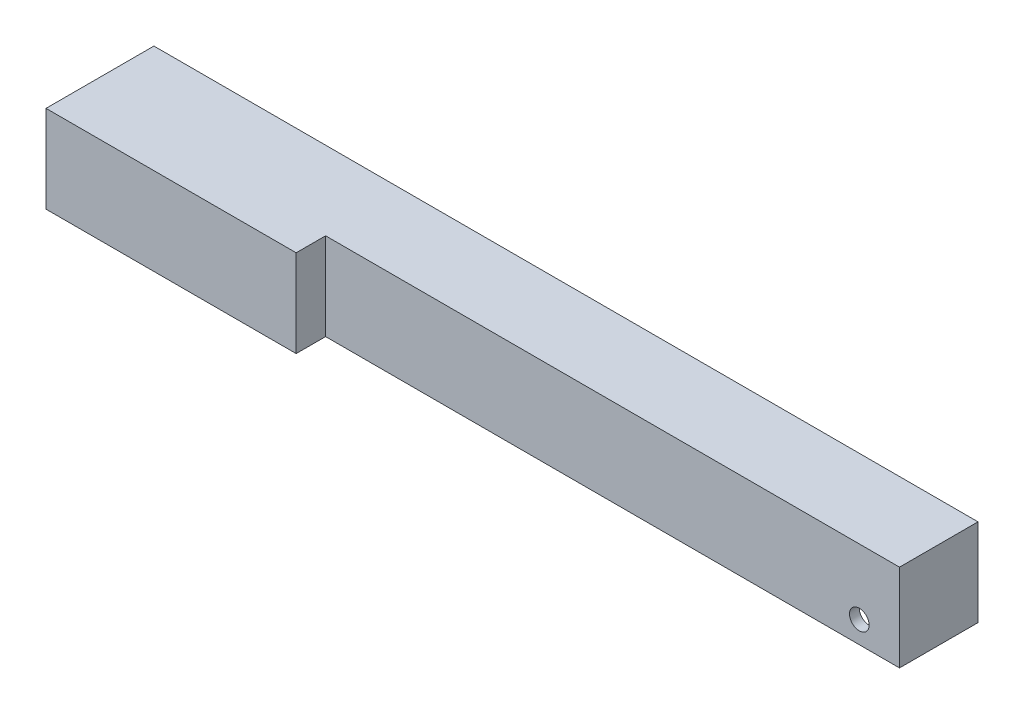
ISO-10303-21;
HEADER;
FILE_DESCRIPTION(('STEP AP214'),'2;1');
FILE_NAME('part.step','',(''),(''),'','','');
FILE_SCHEMA(('AUTOMOTIVE_DESIGN { 1 0 10303 214 1 1 1 1 }'));
ENDSEC;
DATA;
#1=APPLICATION_CONTEXT('core data for automotive mechanical design processes');
#2=APPLICATION_PROTOCOL_DEFINITION('international standard','automotive_design',2000,#1);
#3=PRODUCT_CONTEXT('',#1,'mechanical');
#4=PRODUCT('Part','Part','',(#3));
#5=PRODUCT_RELATED_PRODUCT_CATEGORY('part','',(#4));
#6=PRODUCT_DEFINITION_FORMATION('','',#4);
#7=PRODUCT_DEFINITION_CONTEXT('part definition',#1,'design');
#8=PRODUCT_DEFINITION('design','',#6,#7);
#9=PRODUCT_DEFINITION_SHAPE('','',#8);
#10=(LENGTH_UNIT() NAMED_UNIT(*) SI_UNIT(.MILLI.,.METRE.));
#11=(NAMED_UNIT(*) PLANE_ANGLE_UNIT() SI_UNIT($,.RADIAN.));
#12=(NAMED_UNIT(*) SI_UNIT($,.STERADIAN.) SOLID_ANGLE_UNIT());
#13=UNCERTAINTY_MEASURE_WITH_UNIT(LENGTH_MEASURE(1.E-05),#10,'distance_accuracy_value','');
#14=(GEOMETRIC_REPRESENTATION_CONTEXT(3) GLOBAL_UNCERTAINTY_ASSIGNED_CONTEXT((#13)) GLOBAL_UNIT_ASSIGNED_CONTEXT((#10,
#11,#12)) REPRESENTATION_CONTEXT('',''));
#15=CARTESIAN_POINT('',(0.,0.,0.));
#16=DIRECTION('',(0.,0.,1.));
#17=DIRECTION('',(1.,0.,0.));
#18=AXIS2_PLACEMENT_3D('',#15,#16,#17);
#19=CARTESIAN_POINT('',(-82.,164.984847789123,-9.));
#20=DIRECTION('',(0.,0.,-1.));
#21=DIRECTION('',(-1.,0.,0.));
#22=AXIS2_PLACEMENT_3D('',#19,#20,#21);
#23=PLANE('',#22);
#24=CARTESIAN_POINT('',(75.8000000000001,-13.35,-9.));
#25=DIRECTION('',(0.,0.,-1.));
#26=DIRECTION('',(-1.,0.,0.));
#27=AXIS2_PLACEMENT_3D('',#24,#25,#26);
#28=CIRCLE('',#27,2.);
#29=CARTESIAN_POINT('',(73.8000000000001,-13.35,-9.));
#30=VERTEX_POINT('',#29);
#31=EDGE_CURVE('E51',#30,#30,#28,.F.);
#32=ORIENTED_EDGE('',*,*,#31,.F.);
#33=EDGE_LOOP('',(#32));
#34=FACE_BOUND('',#33,.T.);
#35=DIRECTION('',(1.,0.,0.));
#36=VECTOR('',#35,1.);
#37=CARTESIAN_POINT('',(-35.,-12.3,-9.));
#38=LINE('',#37,#36);
#39=CARTESIAN_POINT('',(-82.,-12.3,-9.));
#40=VERTEX_POINT('',#39);
#41=CARTESIAN_POINT('',(-35.,-12.3,-9.));
#42=VERTEX_POINT('',#41);
#43=EDGE_CURVE('E65',#40,#42,#38,.T.);
#44=ORIENTED_EDGE('',*,*,#43,.T.);
#45=DIRECTION('',(0.,-1.,0.));
#46=VECTOR('',#45,1.);
#47=CARTESIAN_POINT('',(-35.,-12.3,-9.));
#48=LINE('',#47,#46);
#49=CARTESIAN_POINT('',(-35.,-14.3,-9.));
#50=VERTEX_POINT('',#49);
#51=EDGE_CURVE('E69',#42,#50,#48,.T.);
#52=ORIENTED_EDGE('',*,*,#51,.T.);
#53=DIRECTION('',(-1.,0.,0.));
#54=VECTOR('',#53,1.);
#55=CARTESIAN_POINT('',(-35.,-14.3,-9.));
#56=LINE('',#55,#54);
#57=CARTESIAN_POINT('',(-82.,-14.3,-9.));
#58=VERTEX_POINT('',#57);
#59=EDGE_CURVE('E196',#50,#58,#56,.T.);
#60=ORIENTED_EDGE('',*,*,#59,.T.);
#61=DIRECTION('',(0.,-1.,0.));
#62=VECTOR('',#61,1.);
#63=CARTESIAN_POINT('',(-82.,164.984847789123,-9.));
#64=LINE('',#63,#62);
#65=CARTESIAN_POINT('',(-82.,-17.8,-9.));
#66=VERTEX_POINT('',#65);
#67=EDGE_CURVE('E185',#58,#66,#64,.T.);
#68=ORIENTED_EDGE('',*,*,#67,.T.);
#69=DIRECTION('',(1.,0.,0.));
#70=VECTOR('',#69,1.);
#71=CARTESIAN_POINT('',(-82.,-17.8,-9.));
#72=LINE('',#71,#70);
#73=CARTESIAN_POINT('',(82.,-17.8,-9.));
#74=VERTEX_POINT('',#73);
#75=EDGE_CURVE('E237',#66,#74,#72,.T.);
#76=ORIENTED_EDGE('',*,*,#75,.T.);
#77=DIRECTION('',(0.,-1.,0.));
#78=VECTOR('',#77,1.);
#79=CARTESIAN_POINT('',(82.,164.984847789123,-9.));
#80=LINE('',#79,#78);
#81=CARTESIAN_POINT('',(82.,-2.,-9.));
#82=VERTEX_POINT('',#81);
#83=EDGE_CURVE('E269',#82,#74,#80,.T.);
#84=ORIENTED_EDGE('',*,*,#83,.F.);
#85=DIRECTION('',(1.,0.,0.));
#86=VECTOR('',#85,1.);
#87=CARTESIAN_POINT('',(-82.,-2.,-9.));
#88=LINE('',#87,#86);
#89=CARTESIAN_POINT('',(-82.,-2.,-9.));
#90=VERTEX_POINT('',#89);
#91=EDGE_CURVE('E270',#90,#82,#88,.T.);
#92=ORIENTED_EDGE('',*,*,#91,.F.);
#93=EDGE_CURVE('E274',#90,#40,#64,.T.);
#94=ORIENTED_EDGE('',*,*,#93,.T.);
#95=EDGE_LOOP('',(#44,#52,#60,#68,#76,#84,#92,#94));
#96=FACE_BOUND('',#95,.T.);
#97=ADVANCED_FACE('F47',(#34,#96),#23,.F.);
#98=CARTESIAN_POINT('',(-82.,164.984847789123,8.99999999999999));
#99=DIRECTION('',(-1.,0.,0.));
#100=DIRECTION('',(0.,0.,1.));
#101=AXIS2_PLACEMENT_3D('',#98,#99,#100);
#102=PLANE('',#101);
#103=DIRECTION('',(0.,0.,1.));
#104=VECTOR('',#103,1.);
#105=CARTESIAN_POINT('',(-82.,-12.3,-56.0425339453563));
#106=LINE('',#105,#104);
#107=CARTESIAN_POINT('',(-82.,-12.3,8.99999999999999));
#108=VERTEX_POINT('',#107);
#109=EDGE_CURVE('E189',#40,#108,#106,.T.);
#110=ORIENTED_EDGE('',*,*,#109,.F.);
#111=ORIENTED_EDGE('',*,*,#93,.F.);
#112=DIRECTION('',(0.,0.,-1.));
#113=VECTOR('',#112,1.);
#114=CARTESIAN_POINT('',(-82.,-2.,8.99999999999999));
#115=LINE('',#114,#113);
#116=CARTESIAN_POINT('',(-82.,-2.,8.99999999999999));
#117=VERTEX_POINT('',#116);
#118=EDGE_CURVE('E228',#117,#90,#115,.T.);
#119=ORIENTED_EDGE('',*,*,#118,.F.);
#120=DIRECTION('',(0.,-1.,0.));
#121=VECTOR('',#120,1.);
#122=CARTESIAN_POINT('',(-82.,164.984847789123,8.99999999999999));
#123=LINE('',#122,#121);
#124=EDGE_CURVE('E178',#117,#108,#123,.T.);
#125=ORIENTED_EDGE('',*,*,#124,.T.);
#126=EDGE_LOOP('',(#110,#111,#119,#125));
#127=FACE_BOUND('',#126,.T.);
#128=ADVANCED_FACE('F367',(#127),#102,.F.);
#129=DIRECTION('',(0.,0.,1.));
#130=VECTOR('',#129,1.);
#131=CARTESIAN_POINT('',(-82.,-14.3,-56.0425339453563));
#132=LINE('',#131,#130);
#133=CARTESIAN_POINT('',(-82.,-14.3,8.99999999999999));
#134=VERTEX_POINT('',#133);
#135=EDGE_CURVE('E183',#58,#134,#132,.T.);
#136=ORIENTED_EDGE('',*,*,#135,.T.);
#137=CARTESIAN_POINT('',(-82.,-17.8,8.99999999999999));
#138=VERTEX_POINT('',#137);
#139=EDGE_CURVE('E166',#134,#138,#123,.T.);
#140=ORIENTED_EDGE('',*,*,#139,.T.);
#141=DIRECTION('',(0.,0.,-1.));
#142=VECTOR('',#141,1.);
#143=CARTESIAN_POINT('',(-82.,-17.8,8.99999999999999));
#144=LINE('',#143,#142);
#145=EDGE_CURVE('E241',#138,#66,#144,.T.);
#146=ORIENTED_EDGE('',*,*,#145,.T.);
#147=ORIENTED_EDGE('',*,*,#67,.F.);
#148=EDGE_LOOP('',(#136,#140,#146,#147));
#149=FACE_BOUND('',#148,.T.);
#150=ADVANCED_FACE('F184',(#149),#102,.F.);
#151=CARTESIAN_POINT('',(-35.,164.984847789123,2.99999999999999));
#152=DIRECTION('',(1.,0.,0.));
#153=DIRECTION('',(0.,0.,-1.));
#154=AXIS2_PLACEMENT_3D('',#151,#152,#153);
#155=PLANE('',#154);
#156=DIRECTION('',(0.,0.,1.));
#157=VECTOR('',#156,1.);
#158=CARTESIAN_POINT('',(-35.,-12.3,-56.0425339453563));
#159=LINE('',#158,#157);
#160=CARTESIAN_POINT('',(-35.,-12.3,2.99999999999999));
#161=VERTEX_POINT('',#160);
#162=CARTESIAN_POINT('',(-35.,-12.3,8.99999999999999));
#163=VERTEX_POINT('',#162);
#164=EDGE_CURVE('E208',#161,#163,#159,.T.);
#165=ORIENTED_EDGE('',*,*,#164,.T.);
#166=DIRECTION('',(0.,-1.,0.));
#167=VECTOR('',#166,1.);
#168=CARTESIAN_POINT('',(-35.,164.984847789123,8.99999999999999));
#169=LINE('',#168,#167);
#170=CARTESIAN_POINT('',(-35.,-2.,8.99999999999999));
#171=VERTEX_POINT('',#170);
#172=EDGE_CURVE('E252',#171,#163,#169,.T.);
#173=ORIENTED_EDGE('',*,*,#172,.F.);
#174=DIRECTION('',(0.,0.,1.));
#175=VECTOR('',#174,1.);
#176=CARTESIAN_POINT('',(-35.,-2.,2.99999999999999));
#177=LINE('',#176,#175);
#178=CARTESIAN_POINT('',(-35.,-2.,2.99999999999999));
#179=VERTEX_POINT('',#178);
#180=EDGE_CURVE('E253',#179,#171,#177,.T.);
#181=ORIENTED_EDGE('',*,*,#180,.F.);
#182=DIRECTION('',(0.,-1.,0.));
#183=VECTOR('',#182,1.);
#184=CARTESIAN_POINT('',(-35.,164.984847789123,2.99999999999999));
#185=LINE('',#184,#183);
#186=EDGE_CURVE('E258',#179,#161,#185,.T.);
#187=ORIENTED_EDGE('',*,*,#186,.T.);
#188=EDGE_LOOP('',(#165,#173,#181,#187));
#189=FACE_BOUND('',#188,.T.);
#190=ADVANCED_FACE('F452',(#189),#155,.F.);
#191=DIRECTION('',(0.,0.,1.));
#192=VECTOR('',#191,1.);
#193=CARTESIAN_POINT('',(-35.,-14.3,-56.0425339453563));
#194=LINE('',#193,#192);
#195=CARTESIAN_POINT('',(-35.,-14.3,2.99999999999999));
#196=VERTEX_POINT('',#195);
#197=CARTESIAN_POINT('',(-35.,-14.3,8.99999999999999));
#198=VERTEX_POINT('',#197);
#199=EDGE_CURVE('E194',#196,#198,#194,.T.);
#200=ORIENTED_EDGE('',*,*,#199,.F.);
#201=CARTESIAN_POINT('',(-35.,-17.8,2.99999999999999));
#202=VERTEX_POINT('',#201);
#203=EDGE_CURVE('E263',#196,#202,#185,.T.);
#204=ORIENTED_EDGE('',*,*,#203,.T.);
#205=DIRECTION('',(0.,0.,1.));
#206=VECTOR('',#205,1.);
#207=CARTESIAN_POINT('',(-35.,-17.8,2.99999999999999));
#208=LINE('',#207,#206);
#209=CARTESIAN_POINT('',(-35.,-17.8,8.99999999999999));
#210=VERTEX_POINT('',#209);
#211=EDGE_CURVE('E224',#202,#210,#208,.T.);
#212=ORIENTED_EDGE('',*,*,#211,.T.);
#213=EDGE_CURVE('E257',#198,#210,#169,.T.);
#214=ORIENTED_EDGE('',*,*,#213,.F.);
#215=EDGE_LOOP('',(#200,#204,#212,#214));
#216=FACE_BOUND('',#215,.T.);
#217=ADVANCED_FACE('F446',(#216),#155,.F.);
#218=CARTESIAN_POINT('',(-35.,164.984847789123,8.99999999999999));
#219=DIRECTION('',(0.,0.,1.));
#220=DIRECTION('',(1.,0.,0.));
#221=AXIS2_PLACEMENT_3D('',#218,#219,#220);
#222=PLANE('',#221);
#223=DIRECTION('',(1.,0.,0.));
#224=VECTOR('',#223,1.);
#225=CARTESIAN_POINT('',(-35.,-12.3,8.99999999999999));
#226=LINE('',#225,#224);
#227=EDGE_CURVE('E204',#108,#163,#226,.T.);
#228=ORIENTED_EDGE('',*,*,#227,.F.);
#229=ORIENTED_EDGE('',*,*,#124,.F.);
#230=DIRECTION('',(-1.,0.,0.));
#231=VECTOR('',#230,1.);
#232=CARTESIAN_POINT('',(-35.,-2.,8.99999999999999));
#233=LINE('',#232,#231);
#234=EDGE_CURVE('E179',#171,#117,#233,.T.);
#235=ORIENTED_EDGE('',*,*,#234,.F.);
#236=ORIENTED_EDGE('',*,*,#172,.T.);
#237=EDGE_LOOP('',(#228,#229,#235,#236));
#238=FACE_BOUND('',#237,.T.);
#239=ADVANCED_FACE('F441',(#238),#222,.F.);
#240=DIRECTION('',(-1.,0.,0.));
#241=VECTOR('',#240,1.);
#242=CARTESIAN_POINT('',(-35.,-14.3,8.99999999999999));
#243=LINE('',#242,#241);
#244=EDGE_CURVE('E170',#198,#134,#243,.T.);
#245=ORIENTED_EDGE('',*,*,#244,.F.);
#246=ORIENTED_EDGE('',*,*,#213,.T.);
#247=DIRECTION('',(-1.,0.,0.));
#248=VECTOR('',#247,1.);
#249=CARTESIAN_POINT('',(-35.,-17.8,8.99999999999999));
#250=LINE('',#249,#248);
#251=EDGE_CURVE('E173',#210,#138,#250,.T.);
#252=ORIENTED_EDGE('',*,*,#251,.T.);
#253=ORIENTED_EDGE('',*,*,#139,.F.);
#254=EDGE_LOOP('',(#245,#246,#252,#253));
#255=FACE_BOUND('',#254,.T.);
#256=ADVANCED_FACE('F168',(#255),#222,.F.);
#257=CARTESIAN_POINT('',(75.8000000000001,-13.35,-16.6568542494924));
#258=DIRECTION('',(0.,0.,1.));
#259=DIRECTION('',(1.,0.,0.));
#260=AXIS2_PLACEMENT_3D('',#257,#258,#259);
#261=CYLINDRICAL_SURFACE('',#260,2.);
#262=ORIENTED_EDGE('',*,*,#31,.T.);
#263=EDGE_LOOP('',(#262));
#264=FACE_BOUND('',#263,.T.);
#265=CARTESIAN_POINT('',(75.8000000000001,-13.35,-11.));
#266=DIRECTION('',(0.,0.,1.));
#267=DIRECTION('',(1.,0.,0.));
#268=AXIS2_PLACEMENT_3D('',#265,#266,#267);
#269=CIRCLE('',#268,2.);
#270=CARTESIAN_POINT('',(77.8000000000001,-13.35,-11.));
#271=VERTEX_POINT('',#270);
#272=EDGE_CURVE('E314',#271,#271,#269,.F.);
#273=ORIENTED_EDGE('',*,*,#272,.T.);
#274=EDGE_LOOP('',(#273));
#275=FACE_BOUND('',#274,.T.);
#276=ADVANCED_FACE('F363',(#264,#275),#261,.F.);
#277=CARTESIAN_POINT('',(-84.,-17.8,11.));
#278=DIRECTION('',(0.,0.,1.));
#279=DIRECTION('',(1.,0.,0.));
#280=AXIS2_PLACEMENT_3D('',#277,#278,#279);
#281=PLANE('',#280);
#282=DIRECTION('',(0.,1.,0.));
#283=VECTOR('',#282,1.);
#284=CARTESIAN_POINT('',(-33.,-134.9537451386,11.));
#285=LINE('',#284,#283);
#286=CARTESIAN_POINT('',(-33.,-17.8,11.));
#287=VERTEX_POINT('',#286);
#288=CARTESIAN_POINT('',(-33.,0.,11.));
#289=VERTEX_POINT('',#288);
#290=EDGE_CURVE('E294',#287,#289,#285,.T.);
#291=ORIENTED_EDGE('',*,*,#290,.T.);
#292=DIRECTION('',(1.,0.,0.));
#293=VECTOR('',#292,1.);
#294=CARTESIAN_POINT('',(-84.,0.,11.));
#295=LINE('',#294,#293);
#296=CARTESIAN_POINT('',(-84.,0.,11.));
#297=VERTEX_POINT('',#296);
#298=EDGE_CURVE('E318',#297,#289,#295,.T.);
#299=ORIENTED_EDGE('',*,*,#298,.F.);
#300=DIRECTION('',(0.,1.,0.));
#301=VECTOR('',#300,1.);
#302=CARTESIAN_POINT('',(-84.,-17.8,11.));
#303=LINE('',#302,#301);
#304=CARTESIAN_POINT('',(-84.,-17.8,11.));
#305=VERTEX_POINT('',#304);
#306=EDGE_CURVE('E12',#305,#297,#303,.T.);
#307=ORIENTED_EDGE('',*,*,#306,.F.);
#308=DIRECTION('',(1.,0.,0.));
#309=VECTOR('',#308,1.);
#310=CARTESIAN_POINT('',(-84.,-17.8,11.));
#311=LINE('',#310,#309);
#312=EDGE_CURVE('E319',#305,#287,#311,.T.);
#313=ORIENTED_EDGE('',*,*,#312,.T.);
#314=EDGE_LOOP('',(#291,#299,#307,#313));
#315=FACE_BOUND('',#314,.T.);
#316=ADVANCED_FACE('F49',(#315),#281,.T.);
#317=CARTESIAN_POINT('',(-84.,-17.8,11.));
#318=DIRECTION('',(1.,0.,0.));
#319=DIRECTION('',(0.,0.,-1.));
#320=AXIS2_PLACEMENT_3D('',#317,#318,#319);
#321=PLANE('',#320);
#322=DIRECTION('',(0.,0.,-1.));
#323=VECTOR('',#322,1.);
#324=CARTESIAN_POINT('',(-84.,0.,11.));
#325=LINE('',#324,#323);
#326=CARTESIAN_POINT('',(-84.,0.,-11.));
#327=VERTEX_POINT('',#326);
#328=EDGE_CURVE('E324',#297,#327,#325,.T.);
#329=ORIENTED_EDGE('',*,*,#328,.T.);
#330=DIRECTION('',(0.,1.,0.));
#331=VECTOR('',#330,1.);
#332=CARTESIAN_POINT('',(-84.,-17.8,-11.));
#333=LINE('',#332,#331);
#334=CARTESIAN_POINT('',(-84.,-17.8,-11.));
#335=VERTEX_POINT('',#334);
#336=EDGE_CURVE('E57',#335,#327,#333,.T.);
#337=ORIENTED_EDGE('',*,*,#336,.F.);
#338=DIRECTION('',(0.,0.,-1.));
#339=VECTOR('',#338,1.);
#340=CARTESIAN_POINT('',(-84.,-17.8,11.));
#341=LINE('',#340,#339);
#342=EDGE_CURVE('E331',#305,#335,#341,.T.);
#343=ORIENTED_EDGE('',*,*,#342,.F.);
#344=ORIENTED_EDGE('',*,*,#306,.T.);
#345=EDGE_LOOP('',(#329,#337,#343,#344));
#346=FACE_BOUND('',#345,.T.);
#347=ADVANCED_FACE('F403',(#346),#321,.F.);
#348=CARTESIAN_POINT('',(-84.,-17.8,-11.));
#349=DIRECTION('',(0.,0.,1.));
#350=DIRECTION('',(1.,0.,0.));
#351=AXIS2_PLACEMENT_3D('',#348,#349,#350);
#352=PLANE('',#351);
#353=ORIENTED_EDGE('',*,*,#272,.F.);
#354=EDGE_LOOP('',(#353));
#355=FACE_BOUND('',#354,.T.);
#356=DIRECTION('',(1.,0.,0.));
#357=VECTOR('',#356,1.);
#358=CARTESIAN_POINT('',(-84.,0.,-11.));
#359=LINE('',#358,#357);
#360=CARTESIAN_POINT('',(84.,0.,-11.));
#361=VERTEX_POINT('',#360);
#362=EDGE_CURVE('E341',#327,#361,#359,.T.);
#363=ORIENTED_EDGE('',*,*,#362,.T.);
#364=DIRECTION('',(0.,1.,0.));
#365=VECTOR('',#364,1.);
#366=CARTESIAN_POINT('',(84.,-17.8,-11.));
#367=LINE('',#366,#365);
#368=CARTESIAN_POINT('',(84.,-17.8,-11.));
#369=VERTEX_POINT('',#368);
#370=EDGE_CURVE('E334',#369,#361,#367,.T.);
#371=ORIENTED_EDGE('',*,*,#370,.F.);
#372=DIRECTION('',(1.,0.,0.));
#373=VECTOR('',#372,1.);
#374=CARTESIAN_POINT('',(-84.,-17.8,-11.));
#375=LINE('',#374,#373);
#376=EDGE_CURVE('E327',#335,#369,#375,.T.);
#377=ORIENTED_EDGE('',*,*,#376,.F.);
#378=ORIENTED_EDGE('',*,*,#336,.T.);
#379=EDGE_LOOP('',(#363,#371,#377,#378));
#380=FACE_BOUND('',#379,.T.);
#381=ADVANCED_FACE('F406',(#355,#380),#352,.F.);
#382=CARTESIAN_POINT('',(84.,-17.8,11.));
#383=DIRECTION('',(1.,0.,0.));
#384=DIRECTION('',(0.,0.,-1.));
#385=AXIS2_PLACEMENT_3D('',#382,#383,#384);
#386=PLANE('',#385);
#387=DIRECTION('',(0.,1.,0.));
#388=VECTOR('',#387,1.);
#389=CARTESIAN_POINT('',(84.,-134.9537451386,5.));
#390=LINE('',#389,#388);
#391=CARTESIAN_POINT('',(84.,-17.8,5.));
#392=VERTEX_POINT('',#391);
#393=CARTESIAN_POINT('',(84.,0.,5.));
#394=VERTEX_POINT('',#393);
#395=EDGE_CURVE('E302',#392,#394,#390,.T.);
#396=ORIENTED_EDGE('',*,*,#395,.F.);
#397=DIRECTION('',(0.,0.,-1.));
#398=VECTOR('',#397,1.);
#399=CARTESIAN_POINT('',(84.,-17.8,11.));
#400=LINE('',#399,#398);
#401=EDGE_CURVE('E323',#392,#369,#400,.T.);
#402=ORIENTED_EDGE('',*,*,#401,.T.);
#403=ORIENTED_EDGE('',*,*,#370,.T.);
#404=DIRECTION('',(0.,0.,-1.));
#405=VECTOR('',#404,1.);
#406=CARTESIAN_POINT('',(84.,0.,11.));
#407=LINE('',#406,#405);
#408=EDGE_CURVE('E338',#394,#361,#407,.T.);
#409=ORIENTED_EDGE('',*,*,#408,.F.);
#410=EDGE_LOOP('',(#396,#402,#403,#409));
#411=FACE_BOUND('',#410,.T.);
#412=ADVANCED_FACE('F398',(#411),#386,.T.);
#413=CARTESIAN_POINT('',(0.,-17.8,0.));
#414=DIRECTION('',(0.,1.,0.));
#415=DIRECTION('',(0.,0.,1.));
#416=AXIS2_PLACEMENT_3D('',#413,#414,#415);
#417=PLANE('',#416);
#418=ORIENTED_EDGE('',*,*,#75,.F.);
#419=ORIENTED_EDGE('',*,*,#145,.F.);
#420=ORIENTED_EDGE('',*,*,#251,.F.);
#421=ORIENTED_EDGE('',*,*,#211,.F.);
#422=DIRECTION('',(-1.,0.,0.));
#423=VECTOR('',#422,1.);
#424=CARTESIAN_POINT('',(82.,-17.8,3.));
#425=LINE('',#424,#423);
#426=CARTESIAN_POINT('',(82.,-17.8,3.));
#427=VERTEX_POINT('',#426);
#428=EDGE_CURVE('E229',#427,#202,#425,.T.);
#429=ORIENTED_EDGE('',*,*,#428,.F.);
#430=DIRECTION('',(0.,0.,1.));
#431=VECTOR('',#430,1.);
#432=CARTESIAN_POINT('',(82.,-17.8,-9.));
#433=LINE('',#432,#431);
#434=EDGE_CURVE('E233',#74,#427,#433,.T.);
#435=ORIENTED_EDGE('',*,*,#434,.F.);
#436=EDGE_LOOP('',(#418,#419,#420,#421,#429,#435));
#437=FACE_BOUND('',#436,.T.);
#438=DIRECTION('',(1.,0.,0.));
#439=VECTOR('',#438,1.);
#440=CARTESIAN_POINT('',(-33.,-17.8,5.));
#441=LINE('',#440,#439);
#442=CARTESIAN_POINT('',(-33.,-17.8,5.));
#443=VERTEX_POINT('',#442);
#444=EDGE_CURVE('E293',#443,#392,#441,.T.);
#445=ORIENTED_EDGE('',*,*,#444,.F.);
#446=DIRECTION('',(0.,0.,-1.));
#447=VECTOR('',#446,1.);
#448=CARTESIAN_POINT('',(-33.,-17.8,5.));
#449=LINE('',#448,#447);
#450=EDGE_CURVE('E290',#287,#443,#449,.T.);
#451=ORIENTED_EDGE('',*,*,#450,.F.);
#452=ORIENTED_EDGE('',*,*,#312,.F.);
#453=ORIENTED_EDGE('',*,*,#342,.T.);
#454=ORIENTED_EDGE('',*,*,#376,.T.);
#455=ORIENTED_EDGE('',*,*,#401,.F.);
#456=EDGE_LOOP('',(#445,#451,#452,#453,#454,#455));
#457=FACE_BOUND('',#456,.T.);
#458=ADVANCED_FACE('F395',(#437,#457),#417,.F.);
#459=CARTESIAN_POINT('',(0.,0.,0.));
#460=DIRECTION('',(0.,1.,0.));
#461=DIRECTION('',(0.,0.,1.));
#462=AXIS2_PLACEMENT_3D('',#459,#460,#461);
#463=PLANE('',#462);
#464=DIRECTION('',(0.,0.,1.));
#465=VECTOR('',#464,1.);
#466=CARTESIAN_POINT('',(-33.,0.,5.));
#467=LINE('',#466,#465);
#468=CARTESIAN_POINT('',(-33.,0.,5.));
#469=VERTEX_POINT('',#468);
#470=EDGE_CURVE('E299',#469,#289,#467,.T.);
#471=ORIENTED_EDGE('',*,*,#470,.F.);
#472=DIRECTION('',(-1.,0.,0.));
#473=VECTOR('',#472,1.);
#474=CARTESIAN_POINT('',(-33.,0.,5.));
#475=LINE('',#474,#473);
#476=EDGE_CURVE('E295',#394,#469,#475,.T.);
#477=ORIENTED_EDGE('',*,*,#476,.F.);
#478=ORIENTED_EDGE('',*,*,#408,.T.);
#479=ORIENTED_EDGE('',*,*,#362,.F.);
#480=ORIENTED_EDGE('',*,*,#328,.F.);
#481=ORIENTED_EDGE('',*,*,#298,.T.);
#482=EDGE_LOOP('',(#471,#477,#478,#479,#480,#481));
#483=FACE_BOUND('',#482,.T.);
#484=ADVANCED_FACE('F394',(#483),#463,.T.);
#485=CARTESIAN_POINT('',(75.8000000000001,-13.35,3.));
#486=DIRECTION('',(0.,0.,1.));
#487=DIRECTION('',(1.,0.,0.));
#488=AXIS2_PLACEMENT_3D('',#485,#486,#487);
#489=CIRCLE('',#488,2.);
#490=CARTESIAN_POINT('',(77.8000000000001,-13.35,3.));
#491=VERTEX_POINT('',#490);
#492=EDGE_CURVE('E289',#491,#491,#489,.F.);
#493=ORIENTED_EDGE('',*,*,#492,.T.);
#494=EDGE_LOOP('',(#493));
#495=FACE_BOUND('',#494,.T.);
#496=CARTESIAN_POINT('',(75.8000000000001,-13.35,5.));
#497=DIRECTION('',(0.,0.,-1.));
#498=DIRECTION('',(-1.,0.,0.));
#499=AXIS2_PLACEMENT_3D('',#496,#497,#498);
#500=CIRCLE('',#499,2.);
#501=CARTESIAN_POINT('',(73.8000000000001,-13.35,5.));
#502=VERTEX_POINT('',#501);
#503=EDGE_CURVE('E313',#502,#502,#500,.F.);
#504=ORIENTED_EDGE('',*,*,#503,.T.);
#505=EDGE_LOOP('',(#504));
#506=FACE_BOUND('',#505,.T.);
#507=ADVANCED_FACE('F390',(#495,#506),#261,.F.);
#508=CARTESIAN_POINT('',(-33.,-134.9537451386,5.));
#509=DIRECTION('',(0.,0.,-1.));
#510=DIRECTION('',(-1.,0.,0.));
#511=AXIS2_PLACEMENT_3D('',#508,#509,#510);
#512=PLANE('',#511);
#513=ORIENTED_EDGE('',*,*,#444,.T.);
#514=ORIENTED_EDGE('',*,*,#395,.T.);
#515=ORIENTED_EDGE('',*,*,#476,.T.);
#516=DIRECTION('',(0.,1.,0.));
#517=VECTOR('',#516,1.);
#518=CARTESIAN_POINT('',(-33.,-134.9537451386,5.));
#519=LINE('',#518,#517);
#520=EDGE_CURVE('E306',#443,#469,#519,.T.);
#521=ORIENTED_EDGE('',*,*,#520,.F.);
#522=EDGE_LOOP('',(#513,#514,#515,#521));
#523=FACE_BOUND('',#522,.T.);
#524=ORIENTED_EDGE('',*,*,#503,.F.);
#525=EDGE_LOOP('',(#524));
#526=FACE_BOUND('',#525,.T.);
#527=ADVANCED_FACE('F386',(#523,#526),#512,.F.);
#528=CARTESIAN_POINT('',(-33.,-134.9537451386,5.));
#529=DIRECTION('',(-1.,0.,0.));
#530=DIRECTION('',(0.,0.,1.));
#531=AXIS2_PLACEMENT_3D('',#528,#529,#530);
#532=PLANE('',#531);
#533=ORIENTED_EDGE('',*,*,#450,.T.);
#534=ORIENTED_EDGE('',*,*,#520,.T.);
#535=ORIENTED_EDGE('',*,*,#470,.T.);
#536=ORIENTED_EDGE('',*,*,#290,.F.);
#537=EDGE_LOOP('',(#533,#534,#535,#536));
#538=FACE_BOUND('',#537,.T.);
#539=ADVANCED_FACE('F383',(#538),#532,.F.);
#540=CARTESIAN_POINT('',(82.,164.984847789123,3.));
#541=DIRECTION('',(0.,0.,1.));
#542=DIRECTION('',(1.,0.,0.));
#543=AXIS2_PLACEMENT_3D('',#540,#541,#542);
#544=PLANE('',#543);
#545=DIRECTION('',(0.,-1.,0.));
#546=VECTOR('',#545,1.);
#547=CARTESIAN_POINT('',(82.,164.984847789123,3.));
#548=LINE('',#547,#546);
#549=CARTESIAN_POINT('',(82.,-2.,3.));
#550=VERTEX_POINT('',#549);
#551=EDGE_CURVE('E264',#550,#427,#548,.T.);
#552=ORIENTED_EDGE('',*,*,#551,.T.);
#553=ORIENTED_EDGE('',*,*,#428,.T.);
#554=ORIENTED_EDGE('',*,*,#203,.F.);
#555=DIRECTION('',(0.,-1.,0.));
#556=VECTOR('',#555,1.);
#557=CARTESIAN_POINT('',(-35.,164.984847789123,2.99999999999999));
#558=LINE('',#557,#556);
#559=EDGE_CURVE('E211',#161,#196,#558,.T.);
#560=ORIENTED_EDGE('',*,*,#559,.F.);
#561=ORIENTED_EDGE('',*,*,#186,.F.);
#562=DIRECTION('',(-1.,0.,0.));
#563=VECTOR('',#562,1.);
#564=CARTESIAN_POINT('',(82.,-2.,3.));
#565=LINE('',#564,#563);
#566=EDGE_CURVE('E259',#550,#179,#565,.T.);
#567=ORIENTED_EDGE('',*,*,#566,.F.);
#568=EDGE_LOOP('',(#552,#553,#554,#560,#561,#567));
#569=FACE_BOUND('',#568,.T.);
#570=ORIENTED_EDGE('',*,*,#492,.F.);
#571=EDGE_LOOP('',(#570));
#572=FACE_BOUND('',#571,.T.);
#573=ADVANCED_FACE('F381',(#569,#572),#544,.F.);
#574=CARTESIAN_POINT('',(0.,-2.,0.));
#575=DIRECTION('',(0.,1.,0.));
#576=DIRECTION('',(0.,0.,1.));
#577=AXIS2_PLACEMENT_3D('',#574,#575,#576);
#578=PLANE('',#577);
#579=ORIENTED_EDGE('',*,*,#234,.T.);
#580=ORIENTED_EDGE('',*,*,#118,.T.);
#581=ORIENTED_EDGE('',*,*,#91,.T.);
#582=DIRECTION('',(0.,0.,1.));
#583=VECTOR('',#582,1.);
#584=CARTESIAN_POINT('',(82.,-2.,-9.));
#585=LINE('',#584,#583);
#586=EDGE_CURVE('E265',#82,#550,#585,.T.);
#587=ORIENTED_EDGE('',*,*,#586,.T.);
#588=ORIENTED_EDGE('',*,*,#566,.T.);
#589=ORIENTED_EDGE('',*,*,#180,.T.);
#590=EDGE_LOOP('',(#579,#580,#581,#587,#588,#589));
#591=FACE_BOUND('',#590,.T.);
#592=ADVANCED_FACE('F378',(#591),#578,.F.);
#593=CARTESIAN_POINT('',(82.,164.984847789123,-9.));
#594=DIRECTION('',(1.,0.,0.));
#595=DIRECTION('',(0.,0.,-1.));
#596=AXIS2_PLACEMENT_3D('',#593,#594,#595);
#597=PLANE('',#596);
#598=ORIENTED_EDGE('',*,*,#83,.T.);
#599=ORIENTED_EDGE('',*,*,#434,.T.);
#600=ORIENTED_EDGE('',*,*,#551,.F.);
#601=ORIENTED_EDGE('',*,*,#586,.F.);
#602=EDGE_LOOP('',(#598,#599,#600,#601));
#603=FACE_BOUND('',#602,.T.);
#604=ADVANCED_FACE('F375',(#603),#597,.F.);
#605=CARTESIAN_POINT('',(-35.,-12.3,-56.0425339453563));
#606=DIRECTION('',(-1.,0.,0.));
#607=DIRECTION('',(0.,0.,1.));
#608=AXIS2_PLACEMENT_3D('',#605,#606,#607);
#609=PLANE('',#608);
#610=EDGE_CURVE('E217',#42,#161,#159,.T.);
#611=ORIENTED_EDGE('',*,*,#610,.T.);
#612=ORIENTED_EDGE('',*,*,#559,.T.);
#613=EDGE_CURVE('E197',#50,#196,#194,.T.);
#614=ORIENTED_EDGE('',*,*,#613,.F.);
#615=ORIENTED_EDGE('',*,*,#51,.F.);
#616=EDGE_LOOP('',(#611,#612,#614,#615));
#617=FACE_BOUND('',#616,.T.);
#618=ADVANCED_FACE('F473',(#617),#609,.F.);
#619=CARTESIAN_POINT('',(-35.,-12.3,-56.0425339453563));
#620=DIRECTION('',(0.,-1.,0.));
#621=DIRECTION('',(0.,0.,-1.));
#622=AXIS2_PLACEMENT_3D('',#619,#620,#621);
#623=PLANE('',#622);
#624=ORIENTED_EDGE('',*,*,#43,.F.);
#625=ORIENTED_EDGE('',*,*,#109,.T.);
#626=ORIENTED_EDGE('',*,*,#227,.T.);
#627=ORIENTED_EDGE('',*,*,#164,.F.);
#628=ORIENTED_EDGE('',*,*,#610,.F.);
#629=EDGE_LOOP('',(#624,#625,#626,#627,#628));
#630=FACE_BOUND('',#629,.T.);
#631=ADVANCED_FACE('F450',(#630),#623,.F.);
#632=CARTESIAN_POINT('',(-35.,-14.3,-56.0425339453563));
#633=DIRECTION('',(0.,1.,0.));
#634=DIRECTION('',(0.,0.,1.));
#635=AXIS2_PLACEMENT_3D('',#632,#633,#634);
#636=PLANE('',#635);
#637=ORIENTED_EDGE('',*,*,#59,.F.);
#638=ORIENTED_EDGE('',*,*,#613,.T.);
#639=ORIENTED_EDGE('',*,*,#199,.T.);
#640=ORIENTED_EDGE('',*,*,#244,.T.);
#641=ORIENTED_EDGE('',*,*,#135,.F.);
#642=EDGE_LOOP('',(#637,#638,#639,#640,#641));
#643=FACE_BOUND('',#642,.T.);
#644=ADVANCED_FACE('F192',(#643),#636,.F.);
#645=CLOSED_SHELL('',(#97,#128,#150,#190,#217,#239,#256,#276,#316,#347,#381,#412,#458,#484,#507,
#527,#539,#573,#592,#604,#618,#631,#644));
#646=MANIFOLD_SOLID_BREP('B2',#645);
#647=ADVANCED_BREP_SHAPE_REPRESENTATION('',(#18,#646),#14);
#648=SHAPE_DEFINITION_REPRESENTATION(#9,#647);
ENDSEC;
END-ISO-10303-21;
